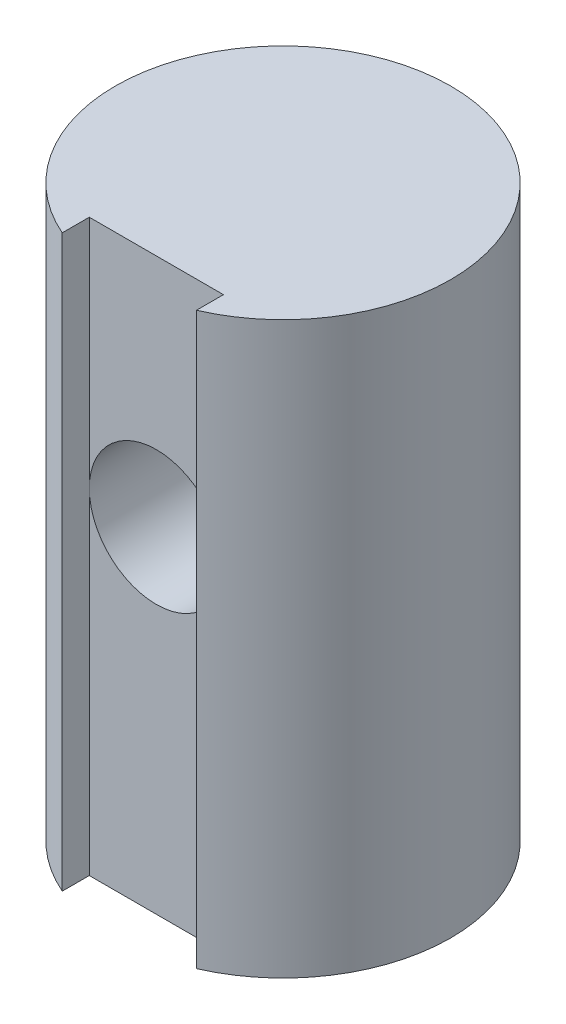
ISO-10303-21;
HEADER;
FILE_DESCRIPTION(('STEP AP214'),'2;1');
FILE_NAME('part.step','',(''),(''),'','','');
FILE_SCHEMA(('AUTOMOTIVE_DESIGN { 1 0 10303 214 1 1 1 1 }'));
ENDSEC;
DATA;
#1=APPLICATION_CONTEXT('core data for automotive mechanical design processes');
#2=APPLICATION_PROTOCOL_DEFINITION('international standard','automotive_design',2000,#1);
#3=PRODUCT_CONTEXT('',#1,'mechanical');
#4=PRODUCT('Part','Part','',(#3));
#5=PRODUCT_RELATED_PRODUCT_CATEGORY('part','',(#4));
#6=PRODUCT_DEFINITION_FORMATION('','',#4);
#7=PRODUCT_DEFINITION_CONTEXT('part definition',#1,'design');
#8=PRODUCT_DEFINITION('design','',#6,#7);
#9=PRODUCT_DEFINITION_SHAPE('','',#8);
#10=(LENGTH_UNIT() NAMED_UNIT(*) SI_UNIT(.MILLI.,.METRE.));
#11=(NAMED_UNIT(*) PLANE_ANGLE_UNIT() SI_UNIT($,.RADIAN.));
#12=(NAMED_UNIT(*) SI_UNIT($,.STERADIAN.) SOLID_ANGLE_UNIT());
#13=UNCERTAINTY_MEASURE_WITH_UNIT(LENGTH_MEASURE(1.E-05),#10,'distance_accuracy_value','');
#14=(GEOMETRIC_REPRESENTATION_CONTEXT(3) GLOBAL_UNCERTAINTY_ASSIGNED_CONTEXT((#13)) GLOBAL_UNIT_ASSIGNED_CONTEXT((#10,
#11,#12)) REPRESENTATION_CONTEXT('',''));
#15=CARTESIAN_POINT('',(0.,0.,0.));
#16=DIRECTION('',(0.,0.,1.));
#17=DIRECTION('',(1.,0.,0.));
#18=AXIS2_PLACEMENT_3D('',#15,#16,#17);
#19=CARTESIAN_POINT('',(-6.35,-22.225,11.9888));
#20=DIRECTION('',(0.,0.,-1.));
#21=DIRECTION('',(-1.,0.,0.));
#22=AXIS2_PLACEMENT_3D('',#19,#20,#21);
#23=PLANE('',#22);
#24=DIRECTION('',(0.,1.,0.));
#25=VECTOR('',#24,1.);
#26=CARTESIAN_POINT('',(-6.35,-22.225,11.9888));
#27=LINE('',#26,#25);
#28=CARTESIAN_POINT('',(-6.34999999999999,31.75,11.9888));
#29=VERTEX_POINT('',#28);
#30=CARTESIAN_POINT('',(-6.35,53.975,11.9888));
#31=VERTEX_POINT('',#30);
#32=EDGE_CURVE('E95',#29,#31,#27,.T.);
#33=ORIENTED_EDGE('',*,*,#32,.F.);
#34=CARTESIAN_POINT('',(0.,31.75,11.9888));
#35=DIRECTION('',(0.,0.,-1.));
#36=DIRECTION('',(-1.,0.,0.));
#37=AXIS2_PLACEMENT_3D('',#34,#35,#36);
#38=CIRCLE('',#37,6.35);
#39=CARTESIAN_POINT('',(6.35,31.75,11.9888));
#40=VERTEX_POINT('',#39);
#41=EDGE_CURVE('E11',#29,#40,#38,.T.);
#42=ORIENTED_EDGE('',*,*,#41,.T.);
#43=DIRECTION('',(0.,1.,0.));
#44=VECTOR('',#43,1.);
#45=CARTESIAN_POINT('',(6.35,-22.225,11.9888));
#46=LINE('',#45,#44);
#47=CARTESIAN_POINT('',(6.35,53.975,11.9888));
#48=VERTEX_POINT('',#47);
#49=EDGE_CURVE('E89',#40,#48,#46,.T.);
#50=ORIENTED_EDGE('',*,*,#49,.T.);
#51=DIRECTION('',(-1.,0.,0.));
#52=VECTOR('',#51,1.);
#53=CARTESIAN_POINT('',(-6.35,53.975,11.9888));
#54=LINE('',#53,#52);
#55=EDGE_CURVE('E131',#48,#31,#54,.T.);
#56=ORIENTED_EDGE('',*,*,#55,.T.);
#57=EDGE_LOOP('',(#33,#42,#50,#56));
#58=FACE_BOUND('',#57,.T.);
#59=ADVANCED_FACE('F39',(#58),#23,.F.);
#60=CARTESIAN_POINT('',(0.,53.975,0.));
#61=DIRECTION('',(0.,-1.,0.));
#62=DIRECTION('',(0.,0.,-1.));
#63=AXIS2_PLACEMENT_3D('',#60,#61,#62);
#64=CYLINDRICAL_SURFACE('',#63,15.875);
#65=CARTESIAN_POINT('',(0.,25.4,-15.875));
#66=CARTESIAN_POINT('',(0.170723607101093,25.4000009775439,-15.8749992379357));
#67=CARTESIAN_POINT('',(0.341513072119474,25.4068945110229,-15.8722383260364));
#68=CARTESIAN_POINT('',(0.68188376788147,25.4344065455583,-15.8612638277614));
#69=CARTESIAN_POINT('',(0.851464115148915,25.4550342133954,-15.853046599604));
#70=CARTESIAN_POINT('',(1.18845576078608,25.5098659858383,-15.8313537744373));
#71=CARTESIAN_POINT('',(1.35586160996959,25.5440991930219,-15.8178669065926));
#72=CARTESIAN_POINT('',(1.68699508198133,25.6258147099291,-15.7859860731003));
#73=CARTESIAN_POINT('',(1.85072117212244,25.6733024338095,-15.7675901023353));
#74=CARTESIAN_POINT('',(2.17272777083705,25.7808742650902,-15.7264467769563));
#75=CARTESIAN_POINT('',(2.33102622962313,25.8409109843008,-15.7037158198671));
#76=CARTESIAN_POINT('',(2.64188036497787,25.9731915315835,-15.6544202856246));
#77=CARTESIAN_POINT('',(2.79443387038562,26.0454399192444,-15.6278542770837));
#78=CARTESIAN_POINT('',(3.09274308140702,26.2015094913571,-15.5715631465376));
#79=CARTESIAN_POINT('',(3.23850394090023,26.2853217040748,-15.5418404776882));
#80=CARTESIAN_POINT('',(3.52257915148065,26.4639687639505,-15.4799301914415));
#81=CARTESIAN_POINT('',(3.66089078078056,26.5588076005522,-15.4477416833469));
#82=CARTESIAN_POINT('',(4.07494983951357,26.8674839755061,-15.345788760516));
#83=CARTESIAN_POINT('',(4.33717782605056,27.0988879918241,-15.2731105916054));
#84=CARTESIAN_POINT('',(4.82027556357494,27.6016206896703,-15.1276056440528));
#85=CARTESIAN_POINT('',(5.04112508053908,27.8729687886015,-15.0547788102182));
#86=CARTESIAN_POINT('',(5.34165986169953,28.3116065523282,-14.9497242617908));
#87=CARTESIAN_POINT('',(5.43842052775526,28.4667696506288,-14.9147052521171));
#88=CARTESIAN_POINT('',(5.61843710064922,28.7853587585731,-14.8478282319793));
#89=CARTESIAN_POINT('',(5.70169856131462,28.9487813336272,-14.81596892366));
#90=CARTESIAN_POINT('',(5.85401285078309,29.2828665745395,-14.7564512316061));
#91=CARTESIAN_POINT('',(5.92306471857994,29.4535297291431,-14.7287931320358));
#92=CARTESIAN_POINT('',(6.04624662742648,29.8008153249024,-14.6786563647696));
#93=CARTESIAN_POINT('',(6.10038414317235,29.9774347309352,-14.656175103504));
#94=CARTESIAN_POINT('',(6.19109128125189,30.3273030540485,-14.6180821344921));
#95=CARTESIAN_POINT('',(6.22834071568416,30.5003470867501,-14.6022072468936));
#96=CARTESIAN_POINT('',(6.28828888894986,30.8493079756058,-14.5764918904644));
#97=CARTESIAN_POINT('',(6.31099419911508,31.025223497467,-14.5666486964789));
#98=CARTESIAN_POINT('',(6.34160512220969,31.3785418492038,-14.5533483916629));
#99=CARTESIAN_POINT('',(6.34951386160877,31.5559443569245,-14.54988993176));
#100=CARTESIAN_POINT('',(6.35044257555404,31.9107916307016,-14.5494847436825));
#101=CARTESIAN_POINT('',(6.34346324452168,32.088236394401,-14.5525377117967));
#102=CARTESIAN_POINT('',(6.31571187824492,32.4293282151924,-14.5646013590056));
#103=CARTESIAN_POINT('',(6.29593775393472,32.5930729587772,-14.5731808070368));
#104=CARTESIAN_POINT('',(6.24378530101208,32.9182315202707,-14.5956012332201));
#105=CARTESIAN_POINT('',(6.21140282408825,33.0796445528705,-14.6094439430184));
#106=CARTESIAN_POINT('',(6.13436035715587,33.3989677872944,-14.641959980119));
#107=CARTESIAN_POINT('',(6.08970332307222,33.5568788225781,-14.6606321443417));
#108=CARTESIAN_POINT('',(5.9884923297172,33.8683205071932,-14.7022643370172));
#109=CARTESIAN_POINT('',(5.93193379827608,34.0218494472492,-14.7252260129798));
#110=CARTESIAN_POINT('',(5.80614447681109,34.326606915998,-14.775282797729));
#111=CARTESIAN_POINT('',(5.73668280778727,34.4777279784641,-14.8024514081795));
#112=CARTESIAN_POINT('',(5.58637380811055,34.7736534971388,-14.8598291662181));
#113=CARTESIAN_POINT('',(5.5055226220591,34.9184557925891,-14.8900393423967));
#114=CARTESIAN_POINT('',(5.33298475743926,35.2009669756883,-14.9527027867207));
#115=CARTESIAN_POINT('',(5.24129662782034,35.3386749098601,-14.9851563550109));
#116=CARTESIAN_POINT('',(5.04764379346816,35.6063035996781,-15.051491344233));
#117=CARTESIAN_POINT('',(4.94567855835441,35.7362239528708,-15.0853728388048));
#118=CARTESIAN_POINT('',(4.72374065123248,35.9973958731327,-15.1564013675384));
#119=CARTESIAN_POINT('',(4.60298473133204,36.127969417402,-15.1935978896649));
#120=CARTESIAN_POINT('',(4.35094499938087,36.3785361413191,-15.2676831467771));
#121=CARTESIAN_POINT('',(4.21966430279858,36.4985324300498,-15.3045719693022));
#122=CARTESIAN_POINT('',(3.94721120347967,36.7273168631247,-15.3770942903877));
#123=CARTESIAN_POINT('',(3.80603314685609,36.8360985119756,-15.4127270536668));
#124=CARTESIAN_POINT('',(3.51472105889454,37.0415966976841,-15.4817555907358));
#125=CARTESIAN_POINT('',(3.3645906402165,37.138318053327,-15.515152255491));
#126=CARTESIAN_POINT('',(3.0530838443351,37.320854689203,-15.5794769293948));
#127=CARTESIAN_POINT('',(2.89154120251666,37.4064091816201,-15.6103411818834));
#128=CARTESIAN_POINT('',(2.56113556699778,37.5634781785282,-15.6679390786474));
#129=CARTESIAN_POINT('',(2.39227555161075,37.6349983309442,-15.6946743836339));
#130=CARTESIAN_POINT('',(2.04840609874292,37.7633354385059,-15.7432461349893));
#131=CARTESIAN_POINT('',(1.87339788816642,37.8201553084516,-15.7650835524063));
#132=CARTESIAN_POINT('',(1.51854727505531,37.9185009907744,-15.8032107951068));
#133=CARTESIAN_POINT('',(1.33870520815153,37.9600278620672,-15.8195010044836));
#134=CARTESIAN_POINT('',(0.986412879014924,38.025321349207,-15.8452497634842));
#135=CARTESIAN_POINT('',(0.814155502955502,38.0499940195391,-15.8550557263235));
#136=CARTESIAN_POINT('',(0.467973143281642,38.0851215768813,-15.8690462489131));
#137=CARTESIAN_POINT('',(0.294048242238786,38.0955771642606,-15.8732310855741));
#138=CARTESIAN_POINT('',(-0.0540764955769258,38.1021554507279,-15.8758620284321));
#139=CARTESIAN_POINT('',(-0.228276263225354,38.0982813115358,-15.8743094005471));
#140=CARTESIAN_POINT('',(-0.575622864622698,38.0762500877826,-15.8655117424955));
#141=CARTESIAN_POINT('',(-0.748769718495297,38.0580932770672,-15.858266821469));
#142=CARTESIAN_POINT('',(-1.08489756413692,38.0088365612771,-15.8387397264841));
#143=CARTESIAN_POINT('',(-1.24798436110302,37.9783586350984,-15.8266999817964));
#144=CARTESIAN_POINT('',(-1.57093270860248,37.9048439618445,-15.7979139535108));
#145=CARTESIAN_POINT('',(-1.73079318547845,37.8618031054116,-15.7811661299578));
#146=CARTESIAN_POINT('',(-2.04615946130208,37.7635681757866,-15.7433819035244));
#147=CARTESIAN_POINT('',(-2.20166645555248,37.7083774761141,-15.7223466911983));
#148=CARTESIAN_POINT('',(-2.50749236746306,37.5862748369083,-15.6764800892104));
#149=CARTESIAN_POINT('',(-2.65780928540707,37.5193584385257,-15.6516472559128));
#150=CARTESIAN_POINT('',(-2.9567997741866,37.3721379384355,-15.5979717110152));
#151=CARTESIAN_POINT('',(-3.10528655007771,37.2914904967998,-15.5690305330525));
#152=CARTESIAN_POINT('',(-3.39500995336589,37.1188782124767,-15.5084314832285));
#153=CARTESIAN_POINT('',(-3.53624407271717,37.0269094916254,-15.4767726815611));
#154=CARTESIAN_POINT('',(-3.81068759574832,36.8322697741589,-15.4114952378658));
#155=CARTESIAN_POINT('',(-3.94389564005318,36.7295969725906,-15.3778762657309));
#156=CARTESIAN_POINT('',(-4.20158482480528,36.5141778604435,-15.3094769599519));
#157=CARTESIAN_POINT('',(-4.3260655846793,36.4014311110542,-15.2746965757592));
#158=CARTESIAN_POINT('',(-4.57360830422331,36.1586973662621,-15.2024813294817));
#159=CARTESIAN_POINT('',(-4.69602961543892,36.0280630186992,-15.1650232941493));
#160=CARTESIAN_POINT('',(-4.92945473983622,35.7568661257529,-15.090762118334));
#161=CARTESIAN_POINT('',(-5.04046209778611,35.6163066857639,-15.0539587774806));
#162=CARTESIAN_POINT('',(-5.25045310181207,35.325941923647,-14.9820123969902));
#163=CARTESIAN_POINT('',(-5.34942984067774,35.1761313638524,-14.946870318152));
#164=CARTESIAN_POINT('',(-5.53453989453151,34.8682710389516,-14.8793212389896));
#165=CARTESIAN_POINT('',(-5.62067860719687,34.7102247744391,-14.8469130917003));
#166=CARTESIAN_POINT('',(-5.78028102521634,34.3851414141103,-14.7855120591914));
#167=CARTESIAN_POINT('',(-5.85360625025088,34.2180289617495,-14.7565574473069));
#168=CARTESIAN_POINT('',(-5.98577798770023,33.8775102748479,-14.7034405307806));
#169=CARTESIAN_POINT('',(-6.04463069642992,33.7041067703995,-14.679276176083));
#170=CARTESIAN_POINT('',(-6.14725596164674,33.3522818084116,-14.6365966526919));
#171=CARTESIAN_POINT('',(-6.19103449456683,33.173862369948,-14.6180792454965));
#172=CARTESIAN_POINT('',(-6.26302669721775,32.8133770299878,-14.5873801728499));
#173=CARTESIAN_POINT('',(-6.29124166997897,32.6313114350819,-14.5751979769997));
#174=CARTESIAN_POINT('',(-6.33029550755702,32.2782893730162,-14.5582759420259));
#175=CARTESIAN_POINT('',(-6.34223928841943,32.1074769932551,-14.5530633618454));
#176=CARTESIAN_POINT('',(-6.35228648895448,31.7653705465324,-14.5486808351446));
#177=CARTESIAN_POINT('',(-6.35039049805518,31.5940765003953,-14.5495106312829));
#178=CARTESIAN_POINT('',(-6.33278160039904,31.2523597912103,-14.5571835389839));
#179=CARTESIAN_POINT('',(-6.31707036953983,31.0819370249914,-14.5640259211725));
#180=CARTESIAN_POINT('',(-6.27201114492921,30.7432416048133,-14.5834872939595));
#181=CARTESIAN_POINT('',(-6.24266321390579,30.5749689409674,-14.5961062579861));
#182=CARTESIAN_POINT('',(-6.172082692541,30.2484418382015,-14.6260871404982));
#183=CARTESIAN_POINT('',(-6.13136993734204,30.0900553047569,-14.6432401640875));
#184=CARTESIAN_POINT('',(-6.03802553073147,29.7773404026148,-14.6819761854047));
#185=CARTESIAN_POINT('',(-5.98538999549603,29.623013374618,-14.7035606264437));
#186=CARTESIAN_POINT('',(-5.86864882245775,29.3193815848358,-14.7505437350288));
#187=CARTESIAN_POINT('',(-5.80454470353523,29.1700761611043,-14.7759418974204));
#188=CARTESIAN_POINT('',(-5.66534290394944,28.8772475882977,-14.8298713538933));
#189=CARTESIAN_POINT('',(-5.5902412299486,28.733726563847,-14.8584037851191));
#190=CARTESIAN_POINT('',(-5.34003416149758,28.2970134954058,-14.9510024576274));
#191=CARTESIAN_POINT('',(-5.14662610364775,28.0149457241491,-15.0192861294896));
#192=CARTESIAN_POINT('',(-4.71764629570959,27.4859211934272,-15.1594916775686));
#193=CARTESIAN_POINT('',(-4.48206183715388,27.2389750570643,-15.2314146456685));
#194=CARTESIAN_POINT('',(-4.09285023991574,26.8916032374013,-15.3389694998403));
#195=CARTESIAN_POINT('',(-3.9523280076533,26.7766091014711,-15.3758635797582));
#196=CARTESIAN_POINT('',(-3.66164523197759,26.5588736188311,-15.4476649582441));
#197=CARTESIAN_POINT('',(-3.51148825306599,26.4561277804501,-15.4825729826643));
#198=CARTESIAN_POINT('',(-3.20228984057822,26.2635575788072,-15.5494698726427));
#199=CARTESIAN_POINT('',(-3.04324019072442,26.1737454488119,-15.5814559641902));
#200=CARTESIAN_POINT('',(-2.71747396731055,26.0079431752459,-15.6415591433313));
#201=CARTESIAN_POINT('',(-2.55076094138471,25.9319467150848,-15.6696779976052));
#202=CARTESIAN_POINT('',(-2.21384500569459,25.7956898355515,-15.7207829722343));
#203=CARTESIAN_POINT('',(-2.04376017151406,25.735169093481,-15.7438529090353));
#204=CARTESIAN_POINT('',(-1.69855327296541,25.6287240308898,-15.7848259421193));
#205=CARTESIAN_POINT('',(-1.52343361694723,25.5827928542439,-15.8027314649683));
#206=CARTESIAN_POINT('',(-1.16989732365691,25.5060843674199,-15.8328255652754));
#207=CARTESIAN_POINT('',(-0.991490150826793,25.4752690042698,-15.8450284948938));
#208=CARTESIAN_POINT('',(-0.632479267780928,25.4289887240137,-15.8634123905131));
#209=CARTESIAN_POINT('',(-0.451877325735067,25.413512184706,-15.8695979158258));
#210=CARTESIAN_POINT('',(-0.22583819734172,25.4038561507717,-15.8734579498475));
#211=CARTESIAN_POINT('',(-0.180685888003587,25.4024104163018,-15.8740359668143));
#212=CARTESIAN_POINT('',(-0.0903572565847043,25.4004822117897,-15.8748070926387));
#213=CARTESIAN_POINT('',(-0.0451809345151426,25.3999997412991,-15.8750002016756));
#214=CARTESIAN_POINT('',(0.,25.4,-15.875));
#215=B_SPLINE_CURVE_WITH_KNOTS('',3,(#65,#66,#67,#68,#69,#70,#71,#72,#73,#74,#75,#76,#77,#78,
#79,#80,#81,#82,#83,#84,#85,#86,#87,#88,#89,#90,#91,#92,#93,#94,#95,#96,#97,#98,#99,#100,#101,
#102,#103,#104,#105,#106,#107,#108,#109,#110,#111,#112,#113,#114,#115,#116,#117,#118,#119,#120,
#121,#122,#123,#124,#125,#126,#127,#128,#129,#130,#131,#132,#133,#134,#135,#136,#137,#138,#139,
#140,#141,#142,#143,#144,#145,#146,#147,#148,#149,#150,#151,#152,#153,#154,#155,#156,#157,#158,
#159,#160,#161,#162,#163,#164,#165,#166,#167,#168,#169,#170,#171,#172,#173,#174,#175,#176,#177,
#178,#179,#180,#181,#182,#183,#184,#185,#186,#187,#188,#189,#190,#191,#192,#193,#194,#195,#196,
#197,#198,#199,#200,#201,#202,#203,#204,#205,#206,#207,#208,#209,#210,#211,#212,#213,#214),
.UNSPECIFIED.,.T.,.F.,(4,2,2,2,2,2,2,2,2,2,2,2,2,2,2,2,2,2,2,2,2,2,2,2,2,2,2,2,2,2,2,2,2,2,2,2,
2,2,2,2,2,2,2,2,2,2,2,2,2,2,2,2,2,2,2,2,2,2,2,2,2,2,2,2,2,2,2,2,2,2,2,2,2,2,4),(0.,
0.512124382311235,1.02459092264965,1.53815959243259,2.05193835066657,2.56381091110559,
3.07587501827014,3.58754405403078,4.09939879164054,5.16602823484464,6.2331779050246,
6.79113951652755,7.34887098638722,7.90664016368849,8.46412929052212,8.99658033452874,
9.52879063629667,10.0608884709664,10.5929614876403,11.0878534150597,11.582908306114,
12.0778440837123,12.5729703478685,13.0780018599333,13.5832047398929,14.0884753425602,
14.5937720345786,15.1382522593458,15.6825719019263,16.2272050625612,16.771619908622,
17.3270693637361,17.8822948254351,18.4374101114507,18.9924869530174,19.5146952887895,
20.0368778983341,20.5589453000502,21.0810026922584,21.5794682470751,22.0780970339697,
22.5765875460674,23.0752680286512,23.589011955189,24.1029323597176,24.6169395635889,
25.1309691679982,25.6790618160507,26.2269837285863,26.7752187515604,27.323222617917,
27.8768249842319,28.4301899149621,28.9833352007382,29.5364341684134,30.0497057439602,
30.562955459688,31.0761429227633,31.5893280252306,32.082076185268,32.5749850885387,
33.0678287600271,33.5608518344752,34.6023735084612,35.6442095404728,36.1995036499712,
36.7545934925732,37.3102049627557,37.8655617623169,38.4108495974275,38.95588080312,
39.4995327989478,40.0427725549058,40.178303131755,40.3138336455117),.UNSPECIFIED.);
#216=CARTESIAN_POINT('',(0.,25.4,-15.875));
#217=VERTEX_POINT('',#216);
#218=EDGE_CURVE('E132',#217,#217,#215,.T.);
#219=ORIENTED_EDGE('',*,*,#218,.T.);
#220=EDGE_LOOP('',(#219));
#221=FACE_BOUND('',#220,.T.);
#222=CARTESIAN_POINT('',(0.,53.975,0.));
#223=DIRECTION('',(0.,1.,0.));
#224=DIRECTION('',(0.,0.,1.));
#225=AXIS2_PLACEMENT_3D('',#222,#223,#224);
#226=CIRCLE('',#225,15.875);
#227=CARTESIAN_POINT('',(6.35,53.975,14.5496778314848));
#228=VERTEX_POINT('',#227);
#229=CARTESIAN_POINT('',(-6.35,53.975,14.5496778314848));
#230=VERTEX_POINT('',#229);
#231=EDGE_CURVE('E113',#228,#230,#226,.T.);
#232=ORIENTED_EDGE('',*,*,#231,.F.);
#233=DIRECTION('',(0.,-1.,0.));
#234=VECTOR('',#233,1.);
#235=CARTESIAN_POINT('',(6.35,53.975,14.5496778314848));
#236=LINE('',#235,#234);
#237=CARTESIAN_POINT('',(6.35,0.,14.5496778314848));
#238=VERTEX_POINT('',#237);
#239=EDGE_CURVE('E115',#228,#238,#236,.T.);
#240=ORIENTED_EDGE('',*,*,#239,.T.);
#241=CARTESIAN_POINT('',(0.,0.,0.));
#242=DIRECTION('',(0.,1.,0.));
#243=DIRECTION('',(0.,0.,1.));
#244=AXIS2_PLACEMENT_3D('',#241,#242,#243);
#245=CIRCLE('',#244,15.875);
#246=CARTESIAN_POINT('',(-6.35,0.,14.5496778314848));
#247=VERTEX_POINT('',#246);
#248=EDGE_CURVE('E111',#238,#247,#245,.T.);
#249=ORIENTED_EDGE('',*,*,#248,.T.);
#250=DIRECTION('',(0.,-1.,0.));
#251=VECTOR('',#250,1.);
#252=CARTESIAN_POINT('',(-6.35,53.975,14.5496778314848));
#253=LINE('',#252,#251);
#254=EDGE_CURVE('E109',#247,#230,#253,.F.);
#255=ORIENTED_EDGE('',*,*,#254,.T.);
#256=EDGE_LOOP('',(#232,#240,#249,#255));
#257=FACE_BOUND('',#256,.T.);
#258=ADVANCED_FACE('F41',(#221,#257),#64,.T.);
#259=CARTESIAN_POINT('',(0.,53.975,0.));
#260=DIRECTION('',(0.,1.,0.));
#261=DIRECTION('',(0.,0.,1.));
#262=AXIS2_PLACEMENT_3D('',#259,#260,#261);
#263=PLANE('',#262);
#264=DIRECTION('',(0.,0.,-1.));
#265=VECTOR('',#264,1.);
#266=CARTESIAN_POINT('',(6.35,53.975,11.9888));
#267=LINE('',#266,#265);
#268=EDGE_CURVE('E99',#228,#48,#267,.T.);
#269=ORIENTED_EDGE('',*,*,#268,.F.);
#270=ORIENTED_EDGE('',*,*,#231,.T.);
#271=DIRECTION('',(0.,0.,1.));
#272=VECTOR('',#271,1.);
#273=CARTESIAN_POINT('',(-6.35,53.975,11.9888));
#274=LINE('',#273,#272);
#275=EDGE_CURVE('E105',#31,#230,#274,.T.);
#276=ORIENTED_EDGE('',*,*,#275,.F.);
#277=ORIENTED_EDGE('',*,*,#55,.F.);
#278=EDGE_LOOP('',(#269,#270,#276,#277));
#279=FACE_BOUND('',#278,.T.);
#280=ADVANCED_FACE('F129',(#279),#263,.T.);
#281=CARTESIAN_POINT('',(0.,0.,0.));
#282=DIRECTION('',(0.,1.,0.));
#283=DIRECTION('',(0.,0.,1.));
#284=AXIS2_PLACEMENT_3D('',#281,#282,#283);
#285=PLANE('',#284);
#286=ORIENTED_EDGE('',*,*,#248,.F.);
#287=DIRECTION('',(0.,0.,-1.));
#288=VECTOR('',#287,1.);
#289=CARTESIAN_POINT('',(6.35,0.,0.));
#290=LINE('',#289,#288);
#291=CARTESIAN_POINT('',(6.35,0.,11.9888));
#292=VERTEX_POINT('',#291);
#293=EDGE_CURVE('E88',#238,#292,#290,.T.);
#294=ORIENTED_EDGE('',*,*,#293,.T.);
#295=DIRECTION('',(-1.,0.,0.));
#296=VECTOR('',#295,1.);
#297=CARTESIAN_POINT('',(0.,0.,11.9888));
#298=LINE('',#297,#296);
#299=CARTESIAN_POINT('',(-6.35,0.,11.9888));
#300=VERTEX_POINT('',#299);
#301=EDGE_CURVE('E106',#292,#300,#298,.T.);
#302=ORIENTED_EDGE('',*,*,#301,.T.);
#303=DIRECTION('',(0.,0.,1.));
#304=VECTOR('',#303,1.);
#305=CARTESIAN_POINT('',(-6.35,0.,0.));
#306=LINE('',#305,#304);
#307=EDGE_CURVE('E121',#300,#247,#306,.T.);
#308=ORIENTED_EDGE('',*,*,#307,.T.);
#309=EDGE_LOOP('',(#286,#294,#302,#308));
#310=FACE_BOUND('',#309,.T.);
#311=ADVANCED_FACE('F125',(#310),#285,.F.);
#312=CARTESIAN_POINT('',(6.35,-22.225,11.9888));
#313=DIRECTION('',(1.,0.,0.));
#314=DIRECTION('',(0.,0.,-1.));
#315=AXIS2_PLACEMENT_3D('',#312,#313,#314);
#316=PLANE('',#315);
#317=ORIENTED_EDGE('',*,*,#49,.F.);
#318=EDGE_CURVE('E100',#292,#40,#46,.T.);
#319=ORIENTED_EDGE('',*,*,#318,.F.);
#320=ORIENTED_EDGE('',*,*,#293,.F.);
#321=ORIENTED_EDGE('',*,*,#239,.F.);
#322=ORIENTED_EDGE('',*,*,#268,.T.);
#323=EDGE_LOOP('',(#317,#319,#320,#321,#322));
#324=FACE_BOUND('',#323,.T.);
#325=ADVANCED_FACE('F92',(#324),#316,.F.);
#326=CARTESIAN_POINT('',(-6.35,-22.225,11.9888));
#327=DIRECTION('',(-1.,0.,0.));
#328=DIRECTION('',(0.,0.,1.));
#329=AXIS2_PLACEMENT_3D('',#326,#327,#328);
#330=PLANE('',#329);
#331=EDGE_CURVE('E56',#300,#29,#27,.T.);
#332=ORIENTED_EDGE('',*,*,#331,.T.);
#333=ORIENTED_EDGE('',*,*,#32,.T.);
#334=ORIENTED_EDGE('',*,*,#275,.T.);
#335=ORIENTED_EDGE('',*,*,#254,.F.);
#336=ORIENTED_EDGE('',*,*,#307,.F.);
#337=EDGE_LOOP('',(#332,#333,#334,#335,#336));
#338=FACE_BOUND('',#337,.T.);
#339=ADVANCED_FACE('F136',(#338),#330,.F.);
#340=ORIENTED_EDGE('',*,*,#318,.T.);
#341=EDGE_CURVE('E42',#40,#29,#38,.T.);
#342=ORIENTED_EDGE('',*,*,#341,.T.);
#343=ORIENTED_EDGE('',*,*,#331,.F.);
#344=ORIENTED_EDGE('',*,*,#301,.F.);
#345=EDGE_LOOP('',(#340,#342,#343,#344));
#346=FACE_BOUND('',#345,.T.);
#347=ADVANCED_FACE('F102',(#346),#23,.F.);
#348=CARTESIAN_POINT('',(0.,31.75,-15.875));
#349=DIRECTION('',(0.,0.,1.));
#350=DIRECTION('',(1.,0.,0.));
#351=AXIS2_PLACEMENT_3D('',#348,#349,#350);
#352=CYLINDRICAL_SURFACE('',#351,6.35);
#353=ORIENTED_EDGE('',*,*,#341,.F.);
#354=ORIENTED_EDGE('',*,*,#41,.F.);
#355=EDGE_LOOP('',(#353,#354));
#356=FACE_BOUND('',#355,.T.);
#357=ORIENTED_EDGE('',*,*,#218,.F.);
#358=EDGE_LOOP('',(#357));
#359=FACE_BOUND('',#358,.T.);
#360=ADVANCED_FACE('F82',(#356,#359),#352,.F.);
#361=CLOSED_SHELL('',(#59,#258,#280,#311,#325,#339,#347,#360));
#362=MANIFOLD_SOLID_BREP('B2',#361);
#363=ADVANCED_BREP_SHAPE_REPRESENTATION('',(#18,#362),#14);
#364=SHAPE_DEFINITION_REPRESENTATION(#9,#363);
ENDSEC;
END-ISO-10303-21;
